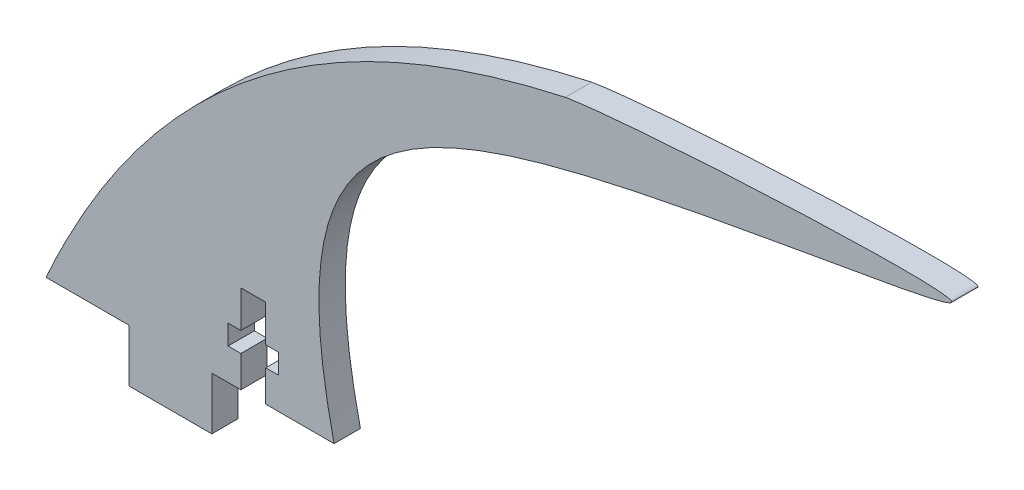
ISO-10303-21;
HEADER;
FILE_DESCRIPTION(('STEP AP214'),'2;1');
FILE_NAME('part.step','',(''),(''),'','','');
FILE_SCHEMA(('AUTOMOTIVE_DESIGN { 1 0 10303 214 1 1 1 1 }'));
ENDSEC;
DATA;
#1=APPLICATION_CONTEXT('core data for automotive mechanical design processes');
#2=APPLICATION_PROTOCOL_DEFINITION('international standard','automotive_design',2000,#1);
#3=PRODUCT_CONTEXT('',#1,'mechanical');
#4=PRODUCT('Part','Part','',(#3));
#5=PRODUCT_RELATED_PRODUCT_CATEGORY('part','',(#4));
#6=PRODUCT_DEFINITION_FORMATION('','',#4);
#7=PRODUCT_DEFINITION_CONTEXT('part definition',#1,'design');
#8=PRODUCT_DEFINITION('design','',#6,#7);
#9=PRODUCT_DEFINITION_SHAPE('','',#8);
#10=(LENGTH_UNIT() NAMED_UNIT(*) SI_UNIT(.MILLI.,.METRE.));
#11=(NAMED_UNIT(*) PLANE_ANGLE_UNIT() SI_UNIT($,.RADIAN.));
#12=(NAMED_UNIT(*) SI_UNIT($,.STERADIAN.) SOLID_ANGLE_UNIT());
#13=UNCERTAINTY_MEASURE_WITH_UNIT(LENGTH_MEASURE(1.E-05),#10,'distance_accuracy_value','');
#14=(GEOMETRIC_REPRESENTATION_CONTEXT(3) GLOBAL_UNCERTAINTY_ASSIGNED_CONTEXT((#13)) GLOBAL_UNIT_ASSIGNED_CONTEXT((#10,
#11,#12)) REPRESENTATION_CONTEXT('',''));
#15=CARTESIAN_POINT('',(0.,0.,0.));
#16=DIRECTION('',(0.,0.,1.));
#17=DIRECTION('',(1.,0.,0.));
#18=AXIS2_PLACEMENT_3D('',#15,#16,#17);
#19=CARTESIAN_POINT('',(-171.469047231991,-33.2991807983448,3.175));
#20=DIRECTION('',(0.,1.,0.));
#21=DIRECTION('',(0.,0.,1.));
#22=AXIS2_PLACEMENT_3D('',#19,#20,#21);
#23=PLANE('',#22);
#24=DIRECTION('',(1.,0.,0.));
#25=VECTOR('',#24,1.);
#26=CARTESIAN_POINT('',(-171.469047231991,-33.2991807983448,0.));
#27=LINE('',#26,#25);
#28=CARTESIAN_POINT('',(-151.469047231991,-33.2991807983448,0.));
#29=VERTEX_POINT('',#28);
#30=CARTESIAN_POINT('',(-147.969047231991,-33.2991807983448,0.));
#31=VERTEX_POINT('',#30);
#32=EDGE_CURVE('E185',#29,#31,#27,.T.);
#33=ORIENTED_EDGE('',*,*,#32,.T.);
#34=DIRECTION('',(0.,0.,1.));
#35=VECTOR('',#34,1.);
#36=CARTESIAN_POINT('',(-147.969047231991,-33.2991807983448,0.));
#37=LINE('',#36,#35);
#38=CARTESIAN_POINT('',(-147.969047231991,-33.2991807983448,3.175));
#39=VERTEX_POINT('',#38);
#40=EDGE_CURVE('E171',#31,#39,#37,.T.);
#41=ORIENTED_EDGE('',*,*,#40,.T.);
#42=DIRECTION('',(1.,0.,0.));
#43=VECTOR('',#42,1.);
#44=CARTESIAN_POINT('',(-171.469047231991,-33.2991807983448,3.175));
#45=LINE('',#44,#43);
#46=CARTESIAN_POINT('',(-151.469047231991,-33.2991807983448,3.175));
#47=VERTEX_POINT('',#46);
#48=EDGE_CURVE('E62',#47,#39,#45,.T.);
#49=ORIENTED_EDGE('',*,*,#48,.F.);
#50=DIRECTION('',(0.,0.,1.));
#51=VECTOR('',#50,1.);
#52=CARTESIAN_POINT('',(-151.469047231991,-33.2991807983448,0.));
#53=LINE('',#52,#51);
#54=EDGE_CURVE('E191',#29,#47,#53,.T.);
#55=ORIENTED_EDGE('',*,*,#54,.F.);
#56=EDGE_LOOP('',(#33,#41,#49,#55));
#57=FACE_BOUND('',#56,.T.);
#58=ADVANCED_FACE('F38',(#57),#23,.F.);
#59=CARTESIAN_POINT('',(-171.469047231991,-33.2991807983448,0.));
#60=VERTEX_POINT('',#59);
#61=CARTESIAN_POINT('',(-161.469047231991,-33.2991807983448,0.));
#62=VERTEX_POINT('',#61);
#63=EDGE_CURVE('E193',#60,#62,#27,.T.);
#64=ORIENTED_EDGE('',*,*,#63,.T.);
#65=DIRECTION('',(0.,0.,1.));
#66=VECTOR('',#65,1.);
#67=CARTESIAN_POINT('',(-161.469047231991,-33.2991807983448,0.));
#68=LINE('',#67,#66);
#69=CARTESIAN_POINT('',(-161.469047231991,-33.2991807983448,3.175));
#70=VERTEX_POINT('',#69);
#71=EDGE_CURVE('E229',#62,#70,#68,.T.);
#72=ORIENTED_EDGE('',*,*,#71,.T.);
#73=CARTESIAN_POINT('',(-171.469047231991,-33.2991807983448,3.175));
#74=VERTEX_POINT('',#73);
#75=EDGE_CURVE('E249',#74,#70,#45,.T.);
#76=ORIENTED_EDGE('',*,*,#75,.F.);
#77=DIRECTION('',(0.,0.,-1.));
#78=VECTOR('',#77,1.);
#79=CARTESIAN_POINT('',(-171.469047231991,-33.2991807983448,3.175));
#80=LINE('',#79,#78);
#81=EDGE_CURVE('E11',#74,#60,#80,.T.);
#82=ORIENTED_EDGE('',*,*,#81,.T.);
#83=EDGE_LOOP('',(#64,#72,#76,#82));
#84=FACE_BOUND('',#83,.T.);
#85=ADVANCED_FACE('F266',(#84),#23,.F.);
#86=CARTESIAN_POINT('',(-108.837882289687,16.8216920047388,3.175));
#87=CARTESIAN_POINT('',(-134.727370928284,11.1331681884567,3.175));
#88=CARTESIAN_POINT('',(-157.456147896644,-2.08208044885469,3.175));
#89=CARTESIAN_POINT('',(-171.469047231991,-33.2991807983448,3.175));
#90=B_SPLINE_CURVE_WITH_KNOTS('',3,(#86,#87,#88,#89),.UNSPECIFIED.,.F.,.F.,(4,4),
(0.527310123633462,1.),.UNSPECIFIED.);
#91=DIRECTION('',(0.,0.,-1.));
#92=VECTOR('',#91,1.);
#93=SURFACE_OF_LINEAR_EXTRUSION('',#90,#92);
#94=CARTESIAN_POINT('',(-108.837882289687,16.8216920047388,0.));
#95=CARTESIAN_POINT('',(-134.727370928284,11.1331681884567,0.));
#96=CARTESIAN_POINT('',(-157.456147896644,-2.08208044885469,0.));
#97=CARTESIAN_POINT('',(-171.469047231991,-33.2991807983448,0.));
#98=B_SPLINE_CURVE_WITH_KNOTS('',3,(#94,#95,#96,#97),.UNSPECIFIED.,.F.,.F.,(4,4),
(0.527310123633462,1.),.UNSPECIFIED.);
#99=CARTESIAN_POINT('',(-108.837882289687,16.8216920047388,0.));
#100=VERTEX_POINT('',#99);
#101=EDGE_CURVE('E197',#100,#60,#98,.T.);
#102=ORIENTED_EDGE('',*,*,#101,.T.);
#103=ORIENTED_EDGE('',*,*,#81,.F.);
#104=CARTESIAN_POINT('',(-108.837882289687,16.8216920047388,3.175));
#105=VERTEX_POINT('',#104);
#106=EDGE_CURVE('E206',#105,#74,#90,.T.);
#107=ORIENTED_EDGE('',*,*,#106,.F.);
#108=DIRECTION('',(0.,0.,-1.));
#109=VECTOR('',#108,1.);
#110=CARTESIAN_POINT('',(-108.837882289687,16.8216920047388,3.175));
#111=LINE('',#110,#109);
#112=EDGE_CURVE('E207',#105,#100,#111,.T.);
#113=ORIENTED_EDGE('',*,*,#112,.T.);
#114=EDGE_LOOP('',(#102,#103,#107,#113));
#115=FACE_BOUND('',#114,.T.);
#116=ADVANCED_FACE('F40',(#115),#93,.F.);
#117=CARTESIAN_POINT('',(-144.969047231991,-33.2991807983448,3.175));
#118=VERTEX_POINT('',#117);
#119=CARTESIAN_POINT('',(-136.722420558106,-33.2991807983448,3.175));
#120=VERTEX_POINT('',#119);
#121=EDGE_CURVE('E248',#118,#120,#45,.T.);
#122=ORIENTED_EDGE('',*,*,#121,.F.);
#123=DIRECTION('',(0.,0.,1.));
#124=VECTOR('',#123,1.);
#125=CARTESIAN_POINT('',(-144.969047231991,-33.2991807983448,0.));
#126=LINE('',#125,#124);
#127=CARTESIAN_POINT('',(-144.969047231991,-33.2991807983448,0.));
#128=VERTEX_POINT('',#127);
#129=EDGE_CURVE('E179',#128,#118,#126,.T.);
#130=ORIENTED_EDGE('',*,*,#129,.F.);
#131=CARTESIAN_POINT('',(-136.722420558106,-33.2991807983448,0.));
#132=VERTEX_POINT('',#131);
#133=EDGE_CURVE('E194',#128,#132,#27,.T.);
#134=ORIENTED_EDGE('',*,*,#133,.T.);
#135=DIRECTION('',(0.,0.,-1.));
#136=VECTOR('',#135,1.);
#137=CARTESIAN_POINT('',(-136.722420558106,-33.2991807983448,3.175));
#138=LINE('',#137,#136);
#139=EDGE_CURVE('E47',#120,#132,#138,.T.);
#140=ORIENTED_EDGE('',*,*,#139,.F.);
#141=EDGE_LOOP('',(#122,#130,#134,#140));
#142=FACE_BOUND('',#141,.T.);
#143=ADVANCED_FACE('F263',(#142),#23,.F.);
#144=CARTESIAN_POINT('',(-136.722420558106,-33.2991807983448,3.175));
#145=CARTESIAN_POINT('',(-143.484345896009,-3.90214478388716,3.175));
#146=CARTESIAN_POINT('',(-123.012581297915,9.730472520853,3.175));
#147=CARTESIAN_POINT('',(-32.5491736029242,21.4730669173754,3.175));
#148=CARTESIAN_POINT('',(-99.6698452305967,18.306784821527,3.175));
#149=CARTESIAN_POINT('',(-108.837882289687,16.8216920047388,3.175));
#150=B_SPLINE_CURVE_WITH_KNOTS('',3,(#144,#145,#146,#147,#148,#149),.UNSPECIFIED.,.F.,.F.,(4,1,
1,4),(0.,0.412772295723735,0.693501812029729,1.),.UNSPECIFIED.);
#151=DIRECTION('',(0.,0.,-1.));
#152=VECTOR('',#151,1.);
#153=SURFACE_OF_LINEAR_EXTRUSION('',#150,#152);
#154=CARTESIAN_POINT('',(-136.722420558106,-33.2991807983448,0.));
#155=CARTESIAN_POINT('',(-143.484345896009,-3.90214478388716,0.));
#156=CARTESIAN_POINT('',(-123.012581297915,9.730472520853,0.));
#157=CARTESIAN_POINT('',(-32.5491736029242,21.4730669173754,0.));
#158=CARTESIAN_POINT('',(-99.6698452305967,18.306784821527,0.));
#159=CARTESIAN_POINT('',(-108.837882289687,16.8216920047388,0.));
#160=B_SPLINE_CURVE_WITH_KNOTS('',3,(#154,#155,#156,#157,#158,#159),.UNSPECIFIED.,.F.,.F.,(4,1,
1,4),(0.,0.412772295723735,0.693501812029729,1.),.UNSPECIFIED.);
#161=EDGE_CURVE('E196',#132,#100,#160,.T.);
#162=ORIENTED_EDGE('',*,*,#161,.T.);
#163=ORIENTED_EDGE('',*,*,#112,.F.);
#164=EDGE_CURVE('E212',#120,#105,#150,.T.);
#165=ORIENTED_EDGE('',*,*,#164,.F.);
#166=ORIENTED_EDGE('',*,*,#139,.T.);
#167=EDGE_LOOP('',(#162,#163,#165,#166));
#168=FACE_BOUND('',#167,.T.);
#169=ADVANCED_FACE('F218',(#168),#153,.F.);
#170=CARTESIAN_POINT('',(-144.607185749557,1.33447180314999,3.175));
#171=DIRECTION('',(0.,0.,-1.));
#172=DIRECTION('',(-1.,0.,0.));
#173=AXIS2_PLACEMENT_3D('',#170,#171,#172);
#174=PLANE('',#173);
#175=ORIENTED_EDGE('',*,*,#48,.T.);
#176=DIRECTION('',(0.,-1.,0.));
#177=VECTOR('',#176,1.);
#178=CARTESIAN_POINT('',(-147.969047231991,-33.2991807983448,3.175));
#179=LINE('',#178,#177);
#180=CARTESIAN_POINT('',(-147.969047231991,-29.4991807983448,3.175));
#181=VERTEX_POINT('',#180);
#182=EDGE_CURVE('E177',#181,#39,#179,.T.);
#183=ORIENTED_EDGE('',*,*,#182,.F.);
#184=DIRECTION('',(1.,0.,0.));
#185=VECTOR('',#184,1.);
#186=CARTESIAN_POINT('',(-149.519047231991,-29.4991807983448,3.175));
#187=LINE('',#186,#185);
#188=CARTESIAN_POINT('',(-149.519047231991,-29.4991807983448,3.175));
#189=VERTEX_POINT('',#188);
#190=EDGE_CURVE('E189',#189,#181,#187,.T.);
#191=ORIENTED_EDGE('',*,*,#190,.F.);
#192=DIRECTION('',(0.,-1.,0.));
#193=VECTOR('',#192,1.);
#194=CARTESIAN_POINT('',(-149.519047231991,-27.0991807983448,3.175));
#195=LINE('',#194,#193);
#196=CARTESIAN_POINT('',(-149.519047231991,-27.0991807983448,3.175));
#197=VERTEX_POINT('',#196);
#198=EDGE_CURVE('E509',#197,#189,#195,.T.);
#199=ORIENTED_EDGE('',*,*,#198,.F.);
#200=DIRECTION('',(-1.,0.,0.));
#201=VECTOR('',#200,1.);
#202=CARTESIAN_POINT('',(-149.519047231991,-27.0991807983448,3.175));
#203=LINE('',#202,#201);
#204=CARTESIAN_POINT('',(-147.969047231991,-27.0991807983448,3.175));
#205=VERTEX_POINT('',#204);
#206=EDGE_CURVE('E506',#205,#197,#203,.T.);
#207=ORIENTED_EDGE('',*,*,#206,.F.);
#208=DIRECTION('',(0.,-1.,0.));
#209=VECTOR('',#208,1.);
#210=CARTESIAN_POINT('',(-147.969047231991,-27.0991807983448,3.175));
#211=LINE('',#210,#209);
#212=CARTESIAN_POINT('',(-147.969047231991,-22.6491807983448,3.175));
#213=VERTEX_POINT('',#212);
#214=EDGE_CURVE('E503',#213,#205,#211,.T.);
#215=ORIENTED_EDGE('',*,*,#214,.F.);
#216=DIRECTION('',(-1.,0.,0.));
#217=VECTOR('',#216,1.);
#218=CARTESIAN_POINT('',(-147.969047231991,-22.6491807983448,3.175));
#219=LINE('',#218,#217);
#220=CARTESIAN_POINT('',(-144.969047231991,-22.6491807983448,3.175));
#221=VERTEX_POINT('',#220);
#222=EDGE_CURVE('E500',#221,#213,#219,.T.);
#223=ORIENTED_EDGE('',*,*,#222,.F.);
#224=DIRECTION('',(0.,1.,0.));
#225=VECTOR('',#224,1.);
#226=CARTESIAN_POINT('',(-144.969047231991,-22.6491807983448,3.175));
#227=LINE('',#226,#225);
#228=CARTESIAN_POINT('',(-144.969047231991,-27.0991807983448,3.175));
#229=VERTEX_POINT('',#228);
#230=EDGE_CURVE('E497',#229,#221,#227,.T.);
#231=ORIENTED_EDGE('',*,*,#230,.F.);
#232=DIRECTION('',(-1.,0.,0.));
#233=VECTOR('',#232,1.);
#234=CARTESIAN_POINT('',(-144.969047231991,-27.0991807983448,3.175));
#235=LINE('',#234,#233);
#236=CARTESIAN_POINT('',(-143.419047231991,-27.0991807983448,3.175));
#237=VERTEX_POINT('',#236);
#238=EDGE_CURVE('E491',#237,#229,#235,.T.);
#239=ORIENTED_EDGE('',*,*,#238,.F.);
#240=DIRECTION('',(0.,1.,0.));
#241=VECTOR('',#240,1.);
#242=CARTESIAN_POINT('',(-143.419047231991,-27.0991807983448,3.175));
#243=LINE('',#242,#241);
#244=CARTESIAN_POINT('',(-143.419047231991,-29.4991807983448,3.175));
#245=VERTEX_POINT('',#244);
#246=EDGE_CURVE('E489',#245,#237,#243,.T.);
#247=ORIENTED_EDGE('',*,*,#246,.F.);
#248=DIRECTION('',(1.,0.,0.));
#249=VECTOR('',#248,1.);
#250=CARTESIAN_POINT('',(-144.969047231991,-29.4991807983448,3.175));
#251=LINE('',#250,#249);
#252=CARTESIAN_POINT('',(-144.969047231991,-29.4991807983448,3.175));
#253=VERTEX_POINT('',#252);
#254=EDGE_CURVE('E483',#253,#245,#251,.T.);
#255=ORIENTED_EDGE('',*,*,#254,.F.);
#256=DIRECTION('',(0.,1.,0.));
#257=VECTOR('',#256,1.);
#258=CARTESIAN_POINT('',(-144.969047231991,-29.4991807983448,3.175));
#259=LINE('',#258,#257);
#260=EDGE_CURVE('E479',#118,#253,#259,.T.);
#261=ORIENTED_EDGE('',*,*,#260,.F.);
#262=ORIENTED_EDGE('',*,*,#121,.T.);
#263=ORIENTED_EDGE('',*,*,#164,.T.);
#264=ORIENTED_EDGE('',*,*,#106,.T.);
#265=ORIENTED_EDGE('',*,*,#75,.T.);
#266=DIRECTION('',(0.,-1.,0.));
#267=VECTOR('',#266,1.);
#268=CARTESIAN_POINT('',(-161.469047231991,-33.2991807983448,3.175));
#269=LINE('',#268,#267);
#270=CARTESIAN_POINT('',(-161.469047231991,-39.6491807983448,3.175));
#271=VERTEX_POINT('',#270);
#272=EDGE_CURVE('E280',#70,#271,#269,.T.);
#273=ORIENTED_EDGE('',*,*,#272,.T.);
#274=DIRECTION('',(1.,0.,0.));
#275=VECTOR('',#274,1.);
#276=CARTESIAN_POINT('',(-161.469047231991,-39.6491807983448,3.175));
#277=LINE('',#276,#275);
#278=CARTESIAN_POINT('',(-151.469047231991,-39.6491807983448,3.175));
#279=VERTEX_POINT('',#278);
#280=EDGE_CURVE('E287',#271,#279,#277,.T.);
#281=ORIENTED_EDGE('',*,*,#280,.T.);
#282=DIRECTION('',(0.,1.,0.));
#283=VECTOR('',#282,1.);
#284=CARTESIAN_POINT('',(-151.469047231991,-39.6491807983448,3.175));
#285=LINE('',#284,#283);
#286=EDGE_CURVE('E237',#279,#47,#285,.T.);
#287=ORIENTED_EDGE('',*,*,#286,.T.);
#288=EDGE_LOOP('',(#175,#183,#191,#199,#207,#215,#223,#231,#239,#247,#255,#261,#262,#263,#264,
#265,#273,#281,#287));
#289=FACE_BOUND('',#288,.T.);
#290=ADVANCED_FACE('F262',(#289),#174,.F.);
#291=CARTESIAN_POINT('',(-144.607185749557,1.33447180314999,0.));
#292=DIRECTION('',(0.,0.,-1.));
#293=DIRECTION('',(-1.,0.,0.));
#294=AXIS2_PLACEMENT_3D('',#291,#292,#293);
#295=PLANE('',#294);
#296=DIRECTION('',(0.,-1.,0.));
#297=VECTOR('',#296,1.);
#298=CARTESIAN_POINT('',(-147.969047231991,-33.2991807983448,0.));
#299=LINE('',#298,#297);
#300=CARTESIAN_POINT('',(-147.969047231991,-29.4991807983448,0.));
#301=VERTEX_POINT('',#300);
#302=EDGE_CURVE('E174',#301,#31,#299,.T.);
#303=ORIENTED_EDGE('',*,*,#302,.T.);
#304=ORIENTED_EDGE('',*,*,#32,.F.);
#305=DIRECTION('',(0.,1.,0.));
#306=VECTOR('',#305,1.);
#307=CARTESIAN_POINT('',(-151.469047231991,-39.6491807983448,0.));
#308=LINE('',#307,#306);
#309=CARTESIAN_POINT('',(-151.469047231991,-39.6491807983448,0.));
#310=VERTEX_POINT('',#309);
#311=EDGE_CURVE('E242',#310,#29,#308,.T.);
#312=ORIENTED_EDGE('',*,*,#311,.F.);
#313=DIRECTION('',(1.,0.,0.));
#314=VECTOR('',#313,1.);
#315=CARTESIAN_POINT('',(-161.469047231991,-39.6491807983448,0.));
#316=LINE('',#315,#314);
#317=CARTESIAN_POINT('',(-161.469047231991,-39.6491807983448,0.));
#318=VERTEX_POINT('',#317);
#319=EDGE_CURVE('E283',#318,#310,#316,.T.);
#320=ORIENTED_EDGE('',*,*,#319,.F.);
#321=DIRECTION('',(0.,-1.,0.));
#322=VECTOR('',#321,1.);
#323=CARTESIAN_POINT('',(-161.469047231991,-33.2991807983448,0.));
#324=LINE('',#323,#322);
#325=EDGE_CURVE('E278',#62,#318,#324,.T.);
#326=ORIENTED_EDGE('',*,*,#325,.F.);
#327=ORIENTED_EDGE('',*,*,#63,.F.);
#328=ORIENTED_EDGE('',*,*,#101,.F.);
#329=ORIENTED_EDGE('',*,*,#161,.F.);
#330=ORIENTED_EDGE('',*,*,#133,.F.);
#331=DIRECTION('',(0.,1.,0.));
#332=VECTOR('',#331,1.);
#333=CARTESIAN_POINT('',(-144.969047231991,-29.4991807983448,0.));
#334=LINE('',#333,#332);
#335=CARTESIAN_POINT('',(-144.969047231991,-29.4991807983448,0.));
#336=VERTEX_POINT('',#335);
#337=EDGE_CURVE('E188',#128,#336,#334,.T.);
#338=ORIENTED_EDGE('',*,*,#337,.T.);
#339=DIRECTION('',(1.,0.,0.));
#340=VECTOR('',#339,1.);
#341=CARTESIAN_POINT('',(-144.969047231991,-29.4991807983448,0.));
#342=LINE('',#341,#340);
#343=CARTESIAN_POINT('',(-143.419047231991,-29.4991807983448,0.));
#344=VERTEX_POINT('',#343);
#345=EDGE_CURVE('E54',#336,#344,#342,.T.);
#346=ORIENTED_EDGE('',*,*,#345,.T.);
#347=DIRECTION('',(0.,1.,0.));
#348=VECTOR('',#347,1.);
#349=CARTESIAN_POINT('',(-143.419047231991,-27.0991807983448,0.));
#350=LINE('',#349,#348);
#351=CARTESIAN_POINT('',(-143.419047231991,-27.0991807983448,0.));
#352=VERTEX_POINT('',#351);
#353=EDGE_CURVE('E533',#344,#352,#350,.T.);
#354=ORIENTED_EDGE('',*,*,#353,.T.);
#355=DIRECTION('',(-1.,0.,0.));
#356=VECTOR('',#355,1.);
#357=CARTESIAN_POINT('',(-144.969047231991,-27.0991807983448,0.));
#358=LINE('',#357,#356);
#359=CARTESIAN_POINT('',(-144.969047231991,-27.0991807983448,0.));
#360=VERTEX_POINT('',#359);
#361=EDGE_CURVE('E536',#352,#360,#358,.T.);
#362=ORIENTED_EDGE('',*,*,#361,.T.);
#363=DIRECTION('',(0.,1.,0.));
#364=VECTOR('',#363,1.);
#365=CARTESIAN_POINT('',(-144.969047231991,-22.6491807983448,0.));
#366=LINE('',#365,#364);
#367=CARTESIAN_POINT('',(-144.969047231991,-22.6491807983448,0.));
#368=VERTEX_POINT('',#367);
#369=EDGE_CURVE('E542',#360,#368,#366,.T.);
#370=ORIENTED_EDGE('',*,*,#369,.T.);
#371=DIRECTION('',(-1.,0.,0.));
#372=VECTOR('',#371,1.);
#373=CARTESIAN_POINT('',(-147.969047231991,-22.6491807983448,0.));
#374=LINE('',#373,#372);
#375=CARTESIAN_POINT('',(-147.969047231991,-22.6491807983448,0.));
#376=VERTEX_POINT('',#375);
#377=EDGE_CURVE('E545',#368,#376,#374,.T.);
#378=ORIENTED_EDGE('',*,*,#377,.T.);
#379=DIRECTION('',(0.,-1.,0.));
#380=VECTOR('',#379,1.);
#381=CARTESIAN_POINT('',(-147.969047231991,-27.0991807983448,0.));
#382=LINE('',#381,#380);
#383=CARTESIAN_POINT('',(-147.969047231991,-27.0991807983448,0.));
#384=VERTEX_POINT('',#383);
#385=EDGE_CURVE('E548',#376,#384,#382,.T.);
#386=ORIENTED_EDGE('',*,*,#385,.T.);
#387=DIRECTION('',(-1.,0.,0.));
#388=VECTOR('',#387,1.);
#389=CARTESIAN_POINT('',(-149.519047231991,-27.0991807983448,0.));
#390=LINE('',#389,#388);
#391=CARTESIAN_POINT('',(-149.519047231991,-27.0991807983448,0.));
#392=VERTEX_POINT('',#391);
#393=EDGE_CURVE('E551',#384,#392,#390,.T.);
#394=ORIENTED_EDGE('',*,*,#393,.T.);
#395=DIRECTION('',(0.,-1.,0.));
#396=VECTOR('',#395,1.);
#397=CARTESIAN_POINT('',(-149.519047231991,-27.0991807983448,0.));
#398=LINE('',#397,#396);
#399=CARTESIAN_POINT('',(-149.519047231991,-29.4991807983448,0.));
#400=VERTEX_POINT('',#399);
#401=EDGE_CURVE('E554',#392,#400,#398,.T.);
#402=ORIENTED_EDGE('',*,*,#401,.T.);
#403=DIRECTION('',(1.,0.,0.));
#404=VECTOR('',#403,1.);
#405=CARTESIAN_POINT('',(-149.519047231991,-29.4991807983448,0.));
#406=LINE('',#405,#404);
#407=EDGE_CURVE('E180',#400,#301,#406,.T.);
#408=ORIENTED_EDGE('',*,*,#407,.T.);
#409=EDGE_LOOP('',(#303,#304,#312,#320,#326,#327,#328,#329,#330,#338,#346,#354,#362,#370,#378,
#386,#394,#402,#408));
#410=FACE_BOUND('',#409,.T.);
#411=ADVANCED_FACE('F183',(#410),#295,.T.);
#412=CARTESIAN_POINT('',(-161.469047231991,-33.2991807983448,0.));
#413=DIRECTION('',(-1.,0.,0.));
#414=DIRECTION('',(0.,0.,1.));
#415=AXIS2_PLACEMENT_3D('',#412,#413,#414);
#416=PLANE('',#415);
#417=ORIENTED_EDGE('',*,*,#272,.F.);
#418=ORIENTED_EDGE('',*,*,#71,.F.);
#419=ORIENTED_EDGE('',*,*,#325,.T.);
#420=DIRECTION('',(0.,0.,1.));
#421=VECTOR('',#420,1.);
#422=CARTESIAN_POINT('',(-161.469047231991,-39.6491807983448,0.));
#423=LINE('',#422,#421);
#424=EDGE_CURVE('E241',#318,#271,#423,.T.);
#425=ORIENTED_EDGE('',*,*,#424,.T.);
#426=EDGE_LOOP('',(#417,#418,#419,#425));
#427=FACE_BOUND('',#426,.T.);
#428=ADVANCED_FACE('F277',(#427),#416,.T.);
#429=CARTESIAN_POINT('',(-151.469047231991,-39.6491807983448,0.));
#430=DIRECTION('',(1.,0.,0.));
#431=DIRECTION('',(0.,0.,-1.));
#432=AXIS2_PLACEMENT_3D('',#429,#430,#431);
#433=PLANE('',#432);
#434=ORIENTED_EDGE('',*,*,#286,.F.);
#435=DIRECTION('',(0.,0.,1.));
#436=VECTOR('',#435,1.);
#437=CARTESIAN_POINT('',(-151.469047231991,-39.6491807983448,0.));
#438=LINE('',#437,#436);
#439=EDGE_CURVE('E234',#310,#279,#438,.T.);
#440=ORIENTED_EDGE('',*,*,#439,.F.);
#441=ORIENTED_EDGE('',*,*,#311,.T.);
#442=ORIENTED_EDGE('',*,*,#54,.T.);
#443=EDGE_LOOP('',(#434,#440,#441,#442));
#444=FACE_BOUND('',#443,.T.);
#445=ADVANCED_FACE('F299',(#444),#433,.T.);
#446=CARTESIAN_POINT('',(-161.469047231991,-39.6491807983448,0.));
#447=DIRECTION('',(0.,-1.,0.));
#448=DIRECTION('',(0.,0.,-1.));
#449=AXIS2_PLACEMENT_3D('',#446,#447,#448);
#450=PLANE('',#449);
#451=ORIENTED_EDGE('',*,*,#280,.F.);
#452=ORIENTED_EDGE('',*,*,#424,.F.);
#453=ORIENTED_EDGE('',*,*,#319,.T.);
#454=ORIENTED_EDGE('',*,*,#439,.T.);
#455=EDGE_LOOP('',(#451,#452,#453,#454));
#456=FACE_BOUND('',#455,.T.);
#457=ADVANCED_FACE('F297',(#456),#450,.T.);
#458=CARTESIAN_POINT('',(-147.969047231991,-33.2991807983448,0.));
#459=DIRECTION('',(-1.,0.,0.));
#460=DIRECTION('',(0.,0.,1.));
#461=AXIS2_PLACEMENT_3D('',#458,#459,#460);
#462=PLANE('',#461);
#463=ORIENTED_EDGE('',*,*,#182,.T.);
#464=ORIENTED_EDGE('',*,*,#40,.F.);
#465=ORIENTED_EDGE('',*,*,#302,.F.);
#466=DIRECTION('',(0.,0.,1.));
#467=VECTOR('',#466,1.);
#468=CARTESIAN_POINT('',(-147.969047231991,-29.4991807983448,0.));
#469=LINE('',#468,#467);
#470=EDGE_CURVE('E291',#301,#181,#469,.T.);
#471=ORIENTED_EDGE('',*,*,#470,.T.);
#472=EDGE_LOOP('',(#463,#464,#465,#471));
#473=FACE_BOUND('',#472,.T.);
#474=ADVANCED_FACE('F173',(#473),#462,.F.);
#475=CARTESIAN_POINT('',(-149.519047231991,-29.4991807983448,0.));
#476=DIRECTION('',(0.,-1.,0.));
#477=DIRECTION('',(0.,0.,-1.));
#478=AXIS2_PLACEMENT_3D('',#475,#476,#477);
#479=PLANE('',#478);
#480=ORIENTED_EDGE('',*,*,#190,.T.);
#481=ORIENTED_EDGE('',*,*,#470,.F.);
#482=ORIENTED_EDGE('',*,*,#407,.F.);
#483=DIRECTION('',(0.,0.,1.));
#484=VECTOR('',#483,1.);
#485=CARTESIAN_POINT('',(-149.519047231991,-29.4991807983448,0.));
#486=LINE('',#485,#484);
#487=EDGE_CURVE('E515',#400,#189,#486,.T.);
#488=ORIENTED_EDGE('',*,*,#487,.T.);
#489=EDGE_LOOP('',(#480,#481,#482,#488));
#490=FACE_BOUND('',#489,.T.);
#491=ADVANCED_FACE('F378',(#490),#479,.F.);
#492=CARTESIAN_POINT('',(-149.519047231991,-27.0991807983448,0.));
#493=DIRECTION('',(-1.,0.,0.));
#494=DIRECTION('',(0.,0.,1.));
#495=AXIS2_PLACEMENT_3D('',#492,#493,#494);
#496=PLANE('',#495);
#497=ORIENTED_EDGE('',*,*,#198,.T.);
#498=ORIENTED_EDGE('',*,*,#487,.F.);
#499=ORIENTED_EDGE('',*,*,#401,.F.);
#500=DIRECTION('',(0.,0.,1.));
#501=VECTOR('',#500,1.);
#502=CARTESIAN_POINT('',(-149.519047231991,-27.0991807983448,0.));
#503=LINE('',#502,#501);
#504=EDGE_CURVE('E517',#392,#197,#503,.T.);
#505=ORIENTED_EDGE('',*,*,#504,.T.);
#506=EDGE_LOOP('',(#497,#498,#499,#505));
#507=FACE_BOUND('',#506,.T.);
#508=ADVANCED_FACE('F385',(#507),#496,.F.);
#509=CARTESIAN_POINT('',(-149.519047231991,-27.0991807983448,0.));
#510=DIRECTION('',(0.,1.,0.));
#511=DIRECTION('',(-1.,0.,0.));
#512=AXIS2_PLACEMENT_3D('',#509,#510,#511);
#513=PLANE('',#512);
#514=ORIENTED_EDGE('',*,*,#206,.T.);
#515=ORIENTED_EDGE('',*,*,#504,.F.);
#516=ORIENTED_EDGE('',*,*,#393,.F.);
#517=DIRECTION('',(0.,0.,1.));
#518=VECTOR('',#517,1.);
#519=CARTESIAN_POINT('',(-147.969047231991,-27.0991807983448,0.));
#520=LINE('',#519,#518);
#521=EDGE_CURVE('E519',#384,#205,#520,.T.);
#522=ORIENTED_EDGE('',*,*,#521,.T.);
#523=EDGE_LOOP('',(#514,#515,#516,#522));
#524=FACE_BOUND('',#523,.T.);
#525=ADVANCED_FACE('F394',(#524),#513,.F.);
#526=CARTESIAN_POINT('',(-147.969047231991,-27.0991807983448,0.));
#527=DIRECTION('',(-1.,0.,0.));
#528=DIRECTION('',(0.,0.,1.));
#529=AXIS2_PLACEMENT_3D('',#526,#527,#528);
#530=PLANE('',#529);
#531=ORIENTED_EDGE('',*,*,#214,.T.);
#532=ORIENTED_EDGE('',*,*,#521,.F.);
#533=ORIENTED_EDGE('',*,*,#385,.F.);
#534=DIRECTION('',(0.,0.,1.));
#535=VECTOR('',#534,1.);
#536=CARTESIAN_POINT('',(-147.969047231991,-22.6491807983448,0.));
#537=LINE('',#536,#535);
#538=EDGE_CURVE('E521',#376,#213,#537,.T.);
#539=ORIENTED_EDGE('',*,*,#538,.T.);
#540=EDGE_LOOP('',(#531,#532,#533,#539));
#541=FACE_BOUND('',#540,.T.);
#542=ADVANCED_FACE('F403',(#541),#530,.F.);
#543=CARTESIAN_POINT('',(-147.969047231991,-22.6491807983448,0.));
#544=DIRECTION('',(0.,1.,0.));
#545=DIRECTION('',(0.,0.,1.));
#546=AXIS2_PLACEMENT_3D('',#543,#544,#545);
#547=PLANE('',#546);
#548=ORIENTED_EDGE('',*,*,#222,.T.);
#549=ORIENTED_EDGE('',*,*,#538,.F.);
#550=ORIENTED_EDGE('',*,*,#377,.F.);
#551=DIRECTION('',(0.,0.,1.));
#552=VECTOR('',#551,1.);
#553=CARTESIAN_POINT('',(-144.969047231991,-22.6491807983448,0.));
#554=LINE('',#553,#552);
#555=EDGE_CURVE('E523',#368,#221,#554,.T.);
#556=ORIENTED_EDGE('',*,*,#555,.T.);
#557=EDGE_LOOP('',(#548,#549,#550,#556));
#558=FACE_BOUND('',#557,.T.);
#559=ADVANCED_FACE('F412',(#558),#547,.F.);
#560=CARTESIAN_POINT('',(-144.969047231991,-22.6491807983448,0.));
#561=DIRECTION('',(1.,0.,0.));
#562=DIRECTION('',(0.,0.,-1.));
#563=AXIS2_PLACEMENT_3D('',#560,#561,#562);
#564=PLANE('',#563);
#565=ORIENTED_EDGE('',*,*,#230,.T.);
#566=ORIENTED_EDGE('',*,*,#555,.F.);
#567=ORIENTED_EDGE('',*,*,#369,.F.);
#568=DIRECTION('',(0.,0.,1.));
#569=VECTOR('',#568,1.);
#570=CARTESIAN_POINT('',(-144.969047231991,-27.0991807983448,0.));
#571=LINE('',#570,#569);
#572=EDGE_CURVE('E525',#360,#229,#571,.T.);
#573=ORIENTED_EDGE('',*,*,#572,.T.);
#574=EDGE_LOOP('',(#565,#566,#567,#573));
#575=FACE_BOUND('',#574,.T.);
#576=ADVANCED_FACE('F421',(#575),#564,.F.);
#577=CARTESIAN_POINT('',(-144.969047231991,-27.0991807983448,0.));
#578=DIRECTION('',(0.,1.,0.));
#579=DIRECTION('',(-1.,0.,0.));
#580=AXIS2_PLACEMENT_3D('',#577,#578,#579);
#581=PLANE('',#580);
#582=ORIENTED_EDGE('',*,*,#238,.T.);
#583=ORIENTED_EDGE('',*,*,#572,.F.);
#584=ORIENTED_EDGE('',*,*,#361,.F.);
#585=DIRECTION('',(0.,0.,1.));
#586=VECTOR('',#585,1.);
#587=CARTESIAN_POINT('',(-143.419047231991,-27.0991807983448,0.));
#588=LINE('',#587,#586);
#589=EDGE_CURVE('E527',#352,#237,#588,.T.);
#590=ORIENTED_EDGE('',*,*,#589,.T.);
#591=EDGE_LOOP('',(#582,#583,#584,#590));
#592=FACE_BOUND('',#591,.T.);
#593=ADVANCED_FACE('F430',(#592),#581,.F.);
#594=CARTESIAN_POINT('',(-143.419047231991,-27.0991807983448,0.));
#595=DIRECTION('',(1.,0.,0.));
#596=DIRECTION('',(0.,0.,-1.));
#597=AXIS2_PLACEMENT_3D('',#594,#595,#596);
#598=PLANE('',#597);
#599=ORIENTED_EDGE('',*,*,#246,.T.);
#600=ORIENTED_EDGE('',*,*,#589,.F.);
#601=ORIENTED_EDGE('',*,*,#353,.F.);
#602=DIRECTION('',(0.,0.,1.));
#603=VECTOR('',#602,1.);
#604=CARTESIAN_POINT('',(-143.419047231991,-29.4991807983448,0.));
#605=LINE('',#604,#603);
#606=EDGE_CURVE('E529',#344,#245,#605,.T.);
#607=ORIENTED_EDGE('',*,*,#606,.T.);
#608=EDGE_LOOP('',(#599,#600,#601,#607));
#609=FACE_BOUND('',#608,.T.);
#610=ADVANCED_FACE('F439',(#609),#598,.F.);
#611=CARTESIAN_POINT('',(-144.969047231991,-29.4991807983448,0.));
#612=DIRECTION('',(0.,-1.,0.));
#613=DIRECTION('',(1.,0.,0.));
#614=AXIS2_PLACEMENT_3D('',#611,#612,#613);
#615=PLANE('',#614);
#616=ORIENTED_EDGE('',*,*,#254,.T.);
#617=ORIENTED_EDGE('',*,*,#606,.F.);
#618=ORIENTED_EDGE('',*,*,#345,.F.);
#619=DIRECTION('',(0.,0.,1.));
#620=VECTOR('',#619,1.);
#621=CARTESIAN_POINT('',(-144.969047231991,-29.4991807983448,0.));
#622=LINE('',#621,#620);
#623=EDGE_CURVE('E481',#336,#253,#622,.T.);
#624=ORIENTED_EDGE('',*,*,#623,.T.);
#625=EDGE_LOOP('',(#616,#617,#618,#624));
#626=FACE_BOUND('',#625,.T.);
#627=ADVANCED_FACE('F448',(#626),#615,.F.);
#628=CARTESIAN_POINT('',(-144.969047231991,-29.4991807983448,0.));
#629=DIRECTION('',(1.,0.,0.));
#630=DIRECTION('',(0.,0.,-1.));
#631=AXIS2_PLACEMENT_3D('',#628,#629,#630);
#632=PLANE('',#631);
#633=ORIENTED_EDGE('',*,*,#260,.T.);
#634=ORIENTED_EDGE('',*,*,#623,.F.);
#635=ORIENTED_EDGE('',*,*,#337,.F.);
#636=ORIENTED_EDGE('',*,*,#129,.T.);
#637=EDGE_LOOP('',(#633,#634,#635,#636));
#638=FACE_BOUND('',#637,.T.);
#639=ADVANCED_FACE('F457',(#638),#632,.F.);
#640=CLOSED_SHELL('',(#58,#85,#116,#143,#169,#290,#411,#428,#445,#457,#474,#491,#508,#525,#542,
#559,#576,#593,#610,#627,#639));
#641=MANIFOLD_SOLID_BREP('B2',#640);
#642=ADVANCED_BREP_SHAPE_REPRESENTATION('',(#18,#641),#14);
#643=SHAPE_DEFINITION_REPRESENTATION(#9,#642);
ENDSEC;
END-ISO-10303-21;
